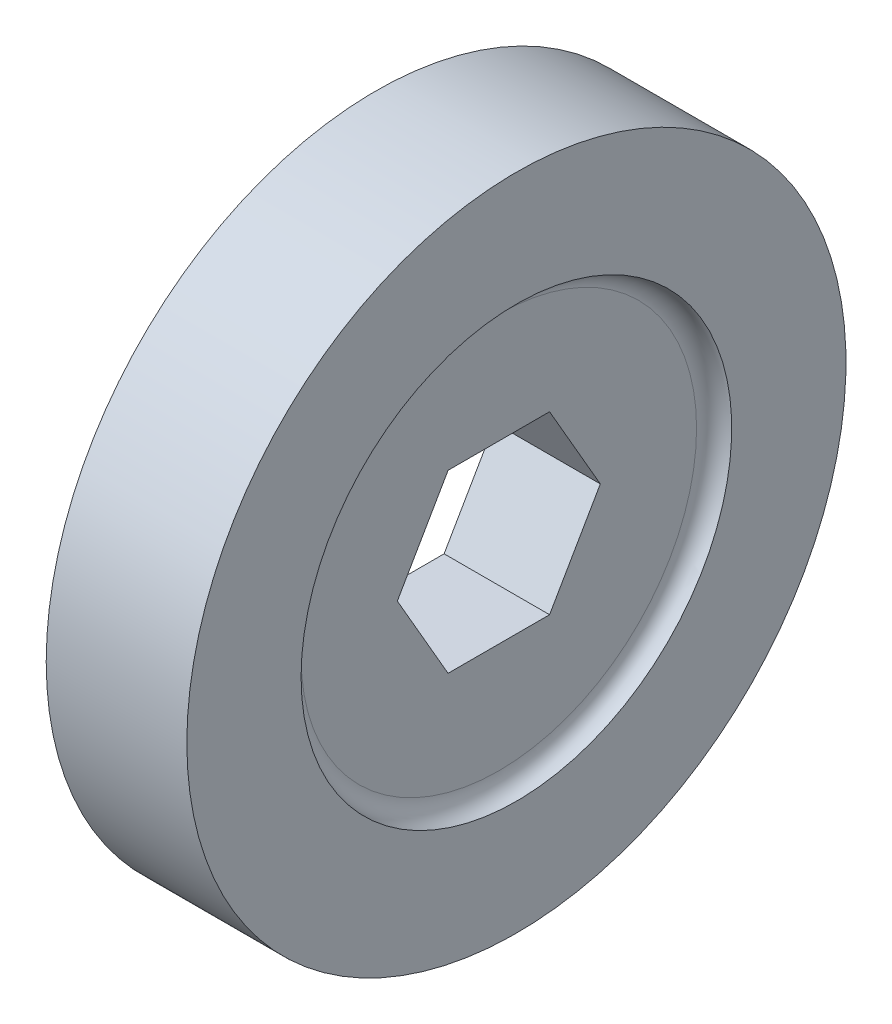
ISO-10303-21;
HEADER;
FILE_DESCRIPTION(('STEP AP214'),'2;1');
FILE_NAME('part.step','',(''),(''),'','','');
FILE_SCHEMA(('AUTOMOTIVE_DESIGN { 1 0 10303 214 1 1 1 1 }'));
ENDSEC;
DATA;
#1=APPLICATION_CONTEXT('core data for automotive mechanical design processes');
#2=APPLICATION_PROTOCOL_DEFINITION('international standard','automotive_design',2000,#1);
#3=PRODUCT_CONTEXT('',#1,'mechanical');
#4=PRODUCT('Part','Part','',(#3));
#5=PRODUCT_RELATED_PRODUCT_CATEGORY('part','',(#4));
#6=PRODUCT_DEFINITION_FORMATION('','',#4);
#7=PRODUCT_DEFINITION_CONTEXT('part definition',#1,'design');
#8=PRODUCT_DEFINITION('design','',#6,#7);
#9=PRODUCT_DEFINITION_SHAPE('','',#8);
#10=(LENGTH_UNIT() NAMED_UNIT(*) SI_UNIT(.MILLI.,.METRE.));
#11=(NAMED_UNIT(*) PLANE_ANGLE_UNIT() SI_UNIT($,.RADIAN.));
#12=(NAMED_UNIT(*) SI_UNIT($,.STERADIAN.) SOLID_ANGLE_UNIT());
#13=UNCERTAINTY_MEASURE_WITH_UNIT(LENGTH_MEASURE(1.E-05),#10,'distance_accuracy_value','');
#14=(GEOMETRIC_REPRESENTATION_CONTEXT(3) GLOBAL_UNCERTAINTY_ASSIGNED_CONTEXT((#13)) GLOBAL_UNIT_ASSIGNED_CONTEXT((#10,
#11,#12)) REPRESENTATION_CONTEXT('',''));
#15=CARTESIAN_POINT('',(0.,0.,0.));
#16=DIRECTION('',(0.,0.,1.));
#17=DIRECTION('',(1.,0.,0.));
#18=AXIS2_PLACEMENT_3D('',#15,#16,#17);
#19=CARTESIAN_POINT('',(-5.08,0.,0.));
#20=DIRECTION('',(1.,0.,0.));
#21=DIRECTION('',(0.,0.,-1.));
#22=AXIS2_PLACEMENT_3D('',#19,#20,#21);
#23=PLANE('',#22);
#24=CARTESIAN_POINT('',(-5.08,0.,0.));
#25=DIRECTION('',(-1.,0.,0.));
#26=DIRECTION('',(0.,0.,1.));
#27=AXIS2_PLACEMENT_3D('',#24,#25,#26);
#28=CIRCLE('',#27,15.5575);
#29=CARTESIAN_POINT('',(-5.08,0.,15.5575));
#30=VERTEX_POINT('',#29);
#31=EDGE_CURVE('E11',#30,#30,#28,.T.);
#32=ORIENTED_EDGE('',*,*,#31,.F.);
#33=EDGE_LOOP('',(#32));
#34=FACE_BOUND('',#33,.T.);
#35=CARTESIAN_POINT('',(-5.08,0.,0.));
#36=DIRECTION('',(-1.,0.,0.));
#37=DIRECTION('',(0.,0.,1.));
#38=AXIS2_PLACEMENT_3D('',#35,#36,#37);
#39=CIRCLE('',#38,23.8125);
#40=CARTESIAN_POINT('',(-5.08,0.,23.8125));
#41=VERTEX_POINT('',#40);
#42=EDGE_CURVE('E105',#41,#41,#39,.T.);
#43=ORIENTED_EDGE('',*,*,#42,.T.);
#44=EDGE_LOOP('',(#43));
#45=FACE_BOUND('',#44,.T.);
#46=ADVANCED_FACE('F39',(#34,#45),#23,.F.);
#47=CARTESIAN_POINT('',(-5.08,0.,0.));
#48=DIRECTION('',(-1.,0.,0.));
#49=DIRECTION('',(0.,0.,1.));
#50=AXIS2_PLACEMENT_3D('',#47,#48,#49);
#51=TOROIDAL_SURFACE('',#50,14.2875,1.27);
#52=CARTESIAN_POINT('',(-3.81,0.,0.));
#53=DIRECTION('',(-1.,0.,0.));
#54=DIRECTION('',(0.,0.,1.));
#55=AXIS2_PLACEMENT_3D('',#52,#53,#54);
#56=CIRCLE('',#55,14.2875);
#57=CARTESIAN_POINT('',(-3.81,0.,14.2875));
#58=VERTEX_POINT('',#57);
#59=EDGE_CURVE('E46',#58,#58,#56,.T.);
#60=ORIENTED_EDGE('',*,*,#59,.F.);
#61=EDGE_LOOP('',(#60));
#62=FACE_BOUND('',#61,.T.);
#63=ORIENTED_EDGE('',*,*,#31,.T.);
#64=EDGE_LOOP('',(#63));
#65=FACE_BOUND('',#64,.T.);
#66=ADVANCED_FACE('F153',(#62,#65),#51,.F.);
#67=CARTESIAN_POINT('',(-3.81,0.,0.));
#68=DIRECTION('',(1.,0.,0.));
#69=DIRECTION('',(0.,0.,-1.));
#70=AXIS2_PLACEMENT_3D('',#67,#68,#69);
#71=PLANE('',#70);
#72=DIRECTION('',(0.,0.,1.));
#73=VECTOR('',#72,1.);
#74=CARTESIAN_POINT('',(-3.81,-6.35,3.66617420935412));
#75=LINE('',#74,#73);
#76=CARTESIAN_POINT('',(-3.81,-6.35,-3.66617420935412));
#77=VERTEX_POINT('',#76);
#78=CARTESIAN_POINT('',(-3.81,-6.35,3.66617420935412));
#79=VERTEX_POINT('',#78);
#80=EDGE_CURVE('E112',#77,#79,#75,.T.);
#81=ORIENTED_EDGE('',*,*,#80,.F.);
#82=DIRECTION('',(0.,-0.866025403784439,0.5));
#83=VECTOR('',#82,1.);
#84=CARTESIAN_POINT('',(-3.81,-6.35,-3.66617420935412));
#85=LINE('',#84,#83);
#86=CARTESIAN_POINT('',(-3.81,0.,-7.33234841870825));
#87=VERTEX_POINT('',#86);
#88=EDGE_CURVE('E93',#87,#77,#85,.T.);
#89=ORIENTED_EDGE('',*,*,#88,.F.);
#90=DIRECTION('',(0.,-0.866025403784439,-0.5));
#91=VECTOR('',#90,1.);
#92=CARTESIAN_POINT('',(-3.81,0.,-7.33234841870825));
#93=LINE('',#92,#91);
#94=CARTESIAN_POINT('',(-3.81,6.35,-3.66617420935412));
#95=VERTEX_POINT('',#94);
#96=EDGE_CURVE('E102',#95,#87,#93,.T.);
#97=ORIENTED_EDGE('',*,*,#96,.F.);
#98=DIRECTION('',(0.,0.,-1.));
#99=VECTOR('',#98,1.);
#100=CARTESIAN_POINT('',(-3.81,6.35,-3.66617420935412));
#101=LINE('',#100,#99);
#102=CARTESIAN_POINT('',(-3.81,6.35,3.66617420935412));
#103=VERTEX_POINT('',#102);
#104=EDGE_CURVE('E53',#103,#95,#101,.T.);
#105=ORIENTED_EDGE('',*,*,#104,.F.);
#106=DIRECTION('',(0.,0.866025403784439,-0.5));
#107=VECTOR('',#106,1.);
#108=CARTESIAN_POINT('',(-3.81,6.35,3.66617420935412));
#109=LINE('',#108,#107);
#110=CARTESIAN_POINT('',(-3.81,0.,7.33234841870825));
#111=VERTEX_POINT('',#110);
#112=EDGE_CURVE('E273',#111,#103,#109,.T.);
#113=ORIENTED_EDGE('',*,*,#112,.F.);
#114=DIRECTION('',(0.,0.866025403784439,0.5));
#115=VECTOR('',#114,1.);
#116=CARTESIAN_POINT('',(-3.81,0.,7.33234841870825));
#117=LINE('',#116,#115);
#118=EDGE_CURVE('E116',#79,#111,#117,.T.);
#119=ORIENTED_EDGE('',*,*,#118,.F.);
#120=EDGE_LOOP('',(#81,#89,#97,#105,#113,#119));
#121=FACE_BOUND('',#120,.T.);
#122=ORIENTED_EDGE('',*,*,#59,.T.);
#123=EDGE_LOOP('',(#122));
#124=FACE_BOUND('',#123,.T.);
#125=ADVANCED_FACE('F108',(#121,#124),#71,.F.);
#126=CARTESIAN_POINT('',(3.81,0.,0.));
#127=DIRECTION('',(1.,0.,0.));
#128=DIRECTION('',(0.,0.,-1.));
#129=AXIS2_PLACEMENT_3D('',#126,#127,#128);
#130=PLANE('',#129);
#131=DIRECTION('',(0.,0.866025403784439,-0.5));
#132=VECTOR('',#131,1.);
#133=CARTESIAN_POINT('',(3.81,-6.35,-3.66617420935412));
#134=LINE('',#133,#132);
#135=CARTESIAN_POINT('',(3.81,-6.35,-3.66617420935412));
#136=VERTEX_POINT('',#135);
#137=CARTESIAN_POINT('',(3.81,0.,-7.33234841870825));
#138=VERTEX_POINT('',#137);
#139=EDGE_CURVE('E61',#136,#138,#134,.T.);
#140=ORIENTED_EDGE('',*,*,#139,.F.);
#141=DIRECTION('',(0.,0.,-1.));
#142=VECTOR('',#141,1.);
#143=CARTESIAN_POINT('',(3.81,-6.35,3.66617420935412));
#144=LINE('',#143,#142);
#145=CARTESIAN_POINT('',(3.81,-6.35,3.66617420935412));
#146=VERTEX_POINT('',#145);
#147=EDGE_CURVE('E99',#146,#136,#144,.T.);
#148=ORIENTED_EDGE('',*,*,#147,.F.);
#149=DIRECTION('',(0.,-0.866025403784439,-0.5));
#150=VECTOR('',#149,1.);
#151=CARTESIAN_POINT('',(3.81,0.,7.33234841870825));
#152=LINE('',#151,#150);
#153=CARTESIAN_POINT('',(3.81,0.,7.33234841870825));
#154=VERTEX_POINT('',#153);
#155=EDGE_CURVE('E127',#154,#146,#152,.T.);
#156=ORIENTED_EDGE('',*,*,#155,.F.);
#157=DIRECTION('',(0.,-0.866025403784439,0.5));
#158=VECTOR('',#157,1.);
#159=CARTESIAN_POINT('',(3.81,6.35,3.66617420935412));
#160=LINE('',#159,#158);
#161=CARTESIAN_POINT('',(3.81,6.35,3.66617420935412));
#162=VERTEX_POINT('',#161);
#163=EDGE_CURVE('E124',#162,#154,#160,.T.);
#164=ORIENTED_EDGE('',*,*,#163,.F.);
#165=DIRECTION('',(0.,0.,1.));
#166=VECTOR('',#165,1.);
#167=CARTESIAN_POINT('',(3.81,6.35,-3.66617420935412));
#168=LINE('',#167,#166);
#169=CARTESIAN_POINT('',(3.81,6.35,-3.66617420935412));
#170=VERTEX_POINT('',#169);
#171=EDGE_CURVE('E121',#170,#162,#168,.T.);
#172=ORIENTED_EDGE('',*,*,#171,.F.);
#173=DIRECTION('',(0.,0.866025403784438,0.5));
#174=VECTOR('',#173,1.);
#175=CARTESIAN_POINT('',(3.81,0.,-7.33234841870825));
#176=LINE('',#175,#174);
#177=EDGE_CURVE('E114',#138,#170,#176,.T.);
#178=ORIENTED_EDGE('',*,*,#177,.F.);
#179=EDGE_LOOP('',(#140,#148,#156,#164,#172,#178));
#180=FACE_BOUND('',#179,.T.);
#181=CARTESIAN_POINT('',(3.81,0.,0.));
#182=DIRECTION('',(-1.,0.,0.));
#183=DIRECTION('',(0.,0.,1.));
#184=AXIS2_PLACEMENT_3D('',#181,#182,#183);
#185=CIRCLE('',#184,14.2875);
#186=CARTESIAN_POINT('',(3.81,0.,14.2875));
#187=VERTEX_POINT('',#186);
#188=EDGE_CURVE('E148',#187,#187,#185,.T.);
#189=ORIENTED_EDGE('',*,*,#188,.F.);
#190=EDGE_LOOP('',(#189));
#191=FACE_BOUND('',#190,.T.);
#192=ADVANCED_FACE('F180',(#180,#191),#130,.T.);
#193=CARTESIAN_POINT('',(5.08,0.,0.));
#194=DIRECTION('',(-1.,0.,0.));
#195=DIRECTION('',(0.,0.,1.));
#196=AXIS2_PLACEMENT_3D('',#193,#194,#195);
#197=TOROIDAL_SURFACE('',#196,14.2875,1.27);
#198=ORIENTED_EDGE('',*,*,#188,.T.);
#199=EDGE_LOOP('',(#198));
#200=FACE_BOUND('',#199,.T.);
#201=CARTESIAN_POINT('',(5.08,0.,0.));
#202=DIRECTION('',(-1.,0.,0.));
#203=DIRECTION('',(0.,0.,1.));
#204=AXIS2_PLACEMENT_3D('',#201,#202,#203);
#205=CIRCLE('',#204,15.5575);
#206=CARTESIAN_POINT('',(5.08,0.,15.5575));
#207=VERTEX_POINT('',#206);
#208=EDGE_CURVE('E145',#207,#207,#205,.T.);
#209=ORIENTED_EDGE('',*,*,#208,.F.);
#210=EDGE_LOOP('',(#209));
#211=FACE_BOUND('',#210,.T.);
#212=ADVANCED_FACE('F173',(#200,#211),#197,.F.);
#213=CARTESIAN_POINT('',(5.08,0.,0.));
#214=DIRECTION('',(1.,0.,0.));
#215=DIRECTION('',(0.,0.,-1.));
#216=AXIS2_PLACEMENT_3D('',#213,#214,#215);
#217=PLANE('',#216);
#218=ORIENTED_EDGE('',*,*,#208,.T.);
#219=EDGE_LOOP('',(#218));
#220=FACE_BOUND('',#219,.T.);
#221=CARTESIAN_POINT('',(5.08,0.,0.));
#222=DIRECTION('',(-1.,0.,0.));
#223=DIRECTION('',(0.,0.,1.));
#224=AXIS2_PLACEMENT_3D('',#221,#222,#223);
#225=CIRCLE('',#224,23.8125);
#226=CARTESIAN_POINT('',(5.08,0.,23.8125));
#227=VERTEX_POINT('',#226);
#228=EDGE_CURVE('E142',#227,#227,#225,.T.);
#229=ORIENTED_EDGE('',*,*,#228,.F.);
#230=EDGE_LOOP('',(#229));
#231=FACE_BOUND('',#230,.T.);
#232=ADVANCED_FACE('F164',(#220,#231),#217,.T.);
#233=CARTESIAN_POINT('',(-6.86942909494839,0.,0.));
#234=DIRECTION('',(-1.,0.,0.));
#235=DIRECTION('',(0.,0.,1.));
#236=AXIS2_PLACEMENT_3D('',#233,#234,#235);
#237=CYLINDRICAL_SURFACE('',#236,23.8125);
#238=ORIENTED_EDGE('',*,*,#228,.T.);
#239=EDGE_LOOP('',(#238));
#240=FACE_BOUND('',#239,.T.);
#241=ORIENTED_EDGE('',*,*,#42,.F.);
#242=EDGE_LOOP('',(#241));
#243=FACE_BOUND('',#242,.T.);
#244=ADVANCED_FACE('F162',(#240,#243),#237,.T.);
#245=CARTESIAN_POINT('',(-5.081,-6.35,-3.66617420935412));
#246=DIRECTION('',(0.,-0.5,-0.866025403784439));
#247=DIRECTION('',(0.,0.866025403784439,-0.5));
#248=AXIS2_PLACEMENT_3D('',#245,#246,#247);
#249=PLANE('',#248);
#250=ORIENTED_EDGE('',*,*,#88,.T.);
#251=DIRECTION('',(1.,0.,0.));
#252=VECTOR('',#251,1.);
#253=CARTESIAN_POINT('',(-5.081,-6.35,-3.66617420935412));
#254=LINE('',#253,#252);
#255=EDGE_CURVE('E106',#77,#136,#254,.T.);
#256=ORIENTED_EDGE('',*,*,#255,.T.);
#257=ORIENTED_EDGE('',*,*,#139,.T.);
#258=DIRECTION('',(1.,0.,0.));
#259=VECTOR('',#258,1.);
#260=CARTESIAN_POINT('',(-5.081,0.,-7.33234841870825));
#261=LINE('',#260,#259);
#262=EDGE_CURVE('E89',#87,#138,#261,.T.);
#263=ORIENTED_EDGE('',*,*,#262,.F.);
#264=EDGE_LOOP('',(#250,#256,#257,#263));
#265=FACE_BOUND('',#264,.T.);
#266=ADVANCED_FACE('F91',(#265),#249,.F.);
#267=CARTESIAN_POINT('',(-5.081,-6.35,3.66617420935412));
#268=DIRECTION('',(0.,-1.,0.));
#269=DIRECTION('',(0.,0.,-1.));
#270=AXIS2_PLACEMENT_3D('',#267,#268,#269);
#271=PLANE('',#270);
#272=ORIENTED_EDGE('',*,*,#80,.T.);
#273=DIRECTION('',(1.,0.,0.));
#274=VECTOR('',#273,1.);
#275=CARTESIAN_POINT('',(-5.081,-6.35,3.66617420935412));
#276=LINE('',#275,#274);
#277=EDGE_CURVE('E133',#79,#146,#276,.T.);
#278=ORIENTED_EDGE('',*,*,#277,.T.);
#279=ORIENTED_EDGE('',*,*,#147,.T.);
#280=ORIENTED_EDGE('',*,*,#255,.F.);
#281=EDGE_LOOP('',(#272,#278,#279,#280));
#282=FACE_BOUND('',#281,.T.);
#283=ADVANCED_FACE('F171',(#282),#271,.F.);
#284=CARTESIAN_POINT('',(-5.081,0.,7.33234841870825));
#285=DIRECTION('',(0.,-0.5,0.866025403784439));
#286=DIRECTION('',(0.,-0.866025403784439,-0.5));
#287=AXIS2_PLACEMENT_3D('',#284,#285,#286);
#288=PLANE('',#287);
#289=ORIENTED_EDGE('',*,*,#118,.T.);
#290=DIRECTION('',(1.,0.,0.));
#291=VECTOR('',#290,1.);
#292=CARTESIAN_POINT('',(-5.081,0.,7.33234841870825));
#293=LINE('',#292,#291);
#294=EDGE_CURVE('E135',#111,#154,#293,.T.);
#295=ORIENTED_EDGE('',*,*,#294,.T.);
#296=ORIENTED_EDGE('',*,*,#155,.T.);
#297=ORIENTED_EDGE('',*,*,#277,.F.);
#298=EDGE_LOOP('',(#289,#295,#296,#297));
#299=FACE_BOUND('',#298,.T.);
#300=ADVANCED_FACE('F231',(#299),#288,.F.);
#301=CARTESIAN_POINT('',(-5.081,6.35,3.66617420935412));
#302=DIRECTION('',(0.,0.5,0.866025403784439));
#303=DIRECTION('',(0.,-0.866025403784439,0.5));
#304=AXIS2_PLACEMENT_3D('',#301,#302,#303);
#305=PLANE('',#304);
#306=ORIENTED_EDGE('',*,*,#112,.T.);
#307=DIRECTION('',(1.,0.,0.));
#308=VECTOR('',#307,1.);
#309=CARTESIAN_POINT('',(-5.081,6.35,3.66617420935412));
#310=LINE('',#309,#308);
#311=EDGE_CURVE('E137',#103,#162,#310,.T.);
#312=ORIENTED_EDGE('',*,*,#311,.T.);
#313=ORIENTED_EDGE('',*,*,#163,.T.);
#314=ORIENTED_EDGE('',*,*,#294,.F.);
#315=EDGE_LOOP('',(#306,#312,#313,#314));
#316=FACE_BOUND('',#315,.T.);
#317=ADVANCED_FACE('F240',(#316),#305,.F.);
#318=CARTESIAN_POINT('',(-5.081,6.35,-3.66617420935412));
#319=DIRECTION('',(0.,1.,0.));
#320=DIRECTION('',(0.,0.,1.));
#321=AXIS2_PLACEMENT_3D('',#318,#319,#320);
#322=PLANE('',#321);
#323=ORIENTED_EDGE('',*,*,#104,.T.);
#324=DIRECTION('',(1.,0.,0.));
#325=VECTOR('',#324,1.);
#326=CARTESIAN_POINT('',(-5.081,6.35,-3.66617420935412));
#327=LINE('',#326,#325);
#328=EDGE_CURVE('E98',#95,#170,#327,.T.);
#329=ORIENTED_EDGE('',*,*,#328,.T.);
#330=ORIENTED_EDGE('',*,*,#171,.T.);
#331=ORIENTED_EDGE('',*,*,#311,.F.);
#332=EDGE_LOOP('',(#323,#329,#330,#331));
#333=FACE_BOUND('',#332,.T.);
#334=ADVANCED_FACE('F249',(#333),#322,.F.);
#335=CARTESIAN_POINT('',(-5.081,0.,-7.33234841870825));
#336=DIRECTION('',(0.,0.5,-0.866025403784439));
#337=DIRECTION('',(0.,0.866025403784439,0.5));
#338=AXIS2_PLACEMENT_3D('',#335,#336,#337);
#339=PLANE('',#338);
#340=ORIENTED_EDGE('',*,*,#96,.T.);
#341=ORIENTED_EDGE('',*,*,#262,.T.);
#342=ORIENTED_EDGE('',*,*,#177,.T.);
#343=ORIENTED_EDGE('',*,*,#328,.F.);
#344=EDGE_LOOP('',(#340,#341,#342,#343));
#345=FACE_BOUND('',#344,.T.);
#346=ADVANCED_FACE('F103',(#345),#339,.F.);
#347=CLOSED_SHELL('',(#46,#66,#125,#192,#212,#232,#244,#266,#283,#300,#317,#334,#346));
#348=MANIFOLD_SOLID_BREP('B2',#347);
#349=ADVANCED_BREP_SHAPE_REPRESENTATION('',(#18,#348),#14);
#350=SHAPE_DEFINITION_REPRESENTATION(#9,#349);
ENDSEC;
END-ISO-10303-21;
